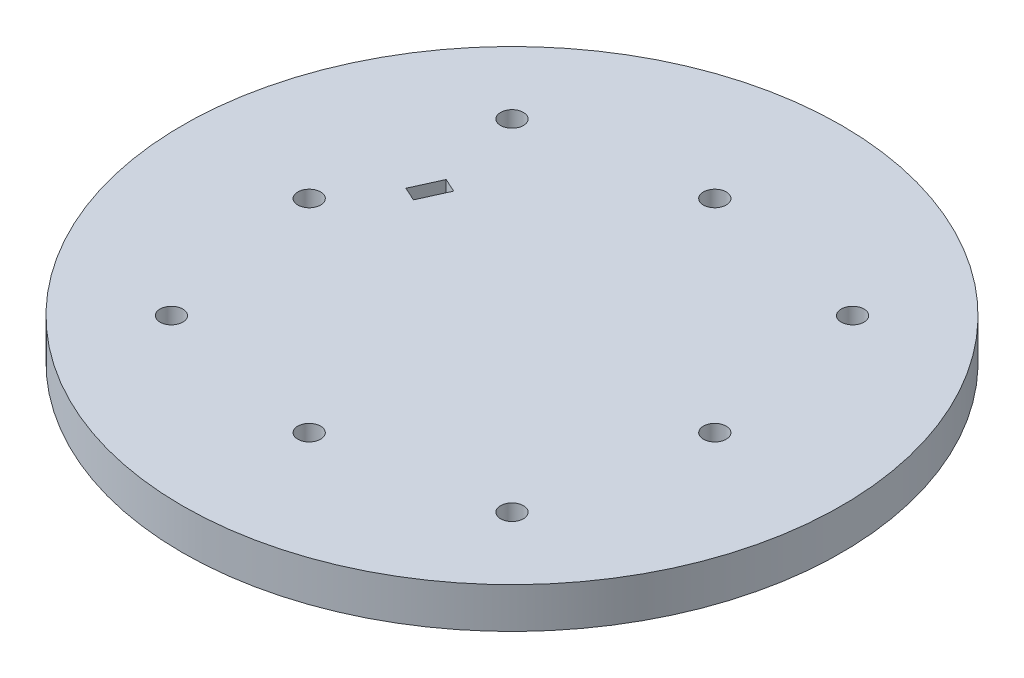
ISO-10303-21;
HEADER;
FILE_DESCRIPTION(('STEP AP214'),'2;1');
FILE_NAME('part.step','',(''),(''),'','','');
FILE_SCHEMA(('AUTOMOTIVE_DESIGN { 1 0 10303 214 1 1 1 1 }'));
ENDSEC;
DATA;
#1=APPLICATION_CONTEXT('core data for automotive mechanical design processes');
#2=APPLICATION_PROTOCOL_DEFINITION('international standard','automotive_design',2000,#1);
#3=PRODUCT_CONTEXT('',#1,'mechanical');
#4=PRODUCT('Part','Part','',(#3));
#5=PRODUCT_RELATED_PRODUCT_CATEGORY('part','',(#4));
#6=PRODUCT_DEFINITION_FORMATION('','',#4);
#7=PRODUCT_DEFINITION_CONTEXT('part definition',#1,'design');
#8=PRODUCT_DEFINITION('design','',#6,#7);
#9=PRODUCT_DEFINITION_SHAPE('','',#8);
#10=(LENGTH_UNIT() NAMED_UNIT(*) SI_UNIT(.MILLI.,.METRE.));
#11=(NAMED_UNIT(*) PLANE_ANGLE_UNIT() SI_UNIT($,.RADIAN.));
#12=(NAMED_UNIT(*) SI_UNIT($,.STERADIAN.) SOLID_ANGLE_UNIT());
#13=UNCERTAINTY_MEASURE_WITH_UNIT(LENGTH_MEASURE(1.E-05),#10,'distance_accuracy_value','');
#14=(GEOMETRIC_REPRESENTATION_CONTEXT(3) GLOBAL_UNCERTAINTY_ASSIGNED_CONTEXT((#13)) GLOBAL_UNIT_ASSIGNED_CONTEXT((#10,
#11,#12)) REPRESENTATION_CONTEXT('',''));
#15=CARTESIAN_POINT('',(0.,0.,0.));
#16=DIRECTION('',(0.,0.,1.));
#17=DIRECTION('',(1.,0.,0.));
#18=AXIS2_PLACEMENT_3D('',#15,#16,#17);
#19=CARTESIAN_POINT('',(0.,8.,0.));
#20=DIRECTION('',(0.,-1.,0.));
#21=DIRECTION('',(0.,0.,-1.));
#22=AXIS2_PLACEMENT_3D('',#19,#20,#21);
#23=CYLINDRICAL_SURFACE('',#22,65.);
#24=CARTESIAN_POINT('',(0.,8.,0.));
#25=DIRECTION('',(0.,1.,0.));
#26=DIRECTION('',(0.,0.,1.));
#27=AXIS2_PLACEMENT_3D('',#24,#25,#26);
#28=CIRCLE('',#27,65.);
#29=CARTESIAN_POINT('',(0.,8.,65.));
#30=VERTEX_POINT('',#29);
#31=EDGE_CURVE('E210',#30,#30,#28,.T.);
#32=ORIENTED_EDGE('',*,*,#31,.F.);
#33=EDGE_LOOP('',(#32));
#34=FACE_BOUND('',#33,.T.);
#35=CARTESIAN_POINT('',(0.,0.,0.));
#36=DIRECTION('',(0.,1.,0.));
#37=DIRECTION('',(0.,0.,1.));
#38=AXIS2_PLACEMENT_3D('',#35,#36,#37);
#39=CIRCLE('',#38,65.);
#40=CARTESIAN_POINT('',(0.,0.,65.));
#41=VERTEX_POINT('',#40);
#42=EDGE_CURVE('E207',#41,#41,#39,.T.);
#43=ORIENTED_EDGE('',*,*,#42,.T.);
#44=EDGE_LOOP('',(#43));
#45=FACE_BOUND('',#44,.T.);
#46=ADVANCED_FACE('F41',(#34,#45),#23,.T.);
#47=CARTESIAN_POINT('',(0.,8.,0.));
#48=DIRECTION('',(0.,1.,0.));
#49=DIRECTION('',(0.,0.,1.));
#50=AXIS2_PLACEMENT_3D('',#47,#48,#49);
#51=PLANE('',#50);
#52=DIRECTION('',(-0.412202483156709,0.,0.911092263648113));
#53=VECTOR('',#52,1.);
#54=CARTESIAN_POINT('',(-29.4804676225616,8.,-10.0450001869136));
#55=LINE('',#54,#53);
#56=CARTESIAN_POINT('',(-27.0072527236214,8.,-15.5115537688023));
#57=VERTEX_POINT('',#56);
#58=CARTESIAN_POINT('',(-29.4804676225616,8.,-10.0450001869136));
#59=VERTEX_POINT('',#58);
#60=EDGE_CURVE('E99',#57,#59,#55,.T.);
#61=ORIENTED_EDGE('',*,*,#60,.T.);
#62=DIRECTION('',(-0.911092263648113,0.,-0.412202483156709));
#63=VECTOR('',#62,1.);
#64=CARTESIAN_POINT('',(-29.4804676225616,8.,-10.0450001869136));
#65=LINE('',#64,#63);
#66=CARTESIAN_POINT('',(-32.213744413506,8.,-11.2816076363837));
#67=VERTEX_POINT('',#66);
#68=EDGE_CURVE('E109',#59,#67,#65,.T.);
#69=ORIENTED_EDGE('',*,*,#68,.T.);
#70=DIRECTION('',(0.412202483156708,0.,-0.911092263648114));
#71=VECTOR('',#70,1.);
#72=CARTESIAN_POINT('',(-32.213744413506,8.,-11.2816076363837));
#73=LINE('',#72,#71);
#74=CARTESIAN_POINT('',(-29.7405295145657,8.,-16.7481612182724));
#75=VERTEX_POINT('',#74);
#76=EDGE_CURVE('E55',#67,#75,#73,.T.);
#77=ORIENTED_EDGE('',*,*,#76,.T.);
#78=DIRECTION('',(0.911092263648114,0.,0.412202483156707));
#79=VECTOR('',#78,1.);
#80=CARTESIAN_POINT('',(-29.7405295145657,8.,-16.7481612182724));
#81=LINE('',#80,#79);
#82=EDGE_CURVE('E106',#75,#57,#81,.T.);
#83=ORIENTED_EDGE('',*,*,#82,.T.);
#84=EDGE_LOOP('',(#61,#69,#77,#83));
#85=FACE_BOUND('',#84,.T.);
#86=CARTESIAN_POINT('',(-33.5875721063614,8.,33.5875721063606));
#87=DIRECTION('',(0.,1.,0.));
#88=DIRECTION('',(0.,0.,1.));
#89=AXIS2_PLACEMENT_3D('',#86,#87,#88);
#90=CIRCLE('',#89,2.25);
#91=CARTESIAN_POINT('',(-33.5875721063614,8.,35.8375721063606));
#92=VERTEX_POINT('',#91);
#93=EDGE_CURVE('E169',#92,#92,#90,.T.);
#94=ORIENTED_EDGE('',*,*,#93,.F.);
#95=EDGE_LOOP('',(#94));
#96=FACE_BOUND('',#95,.T.);
#97=CARTESIAN_POINT('',(33.5875721063607,8.,33.5875721063613));
#98=DIRECTION('',(0.,1.,0.));
#99=DIRECTION('',(0.,0.,1.));
#100=AXIS2_PLACEMENT_3D('',#97,#98,#99);
#101=CIRCLE('',#100,2.25);
#102=CARTESIAN_POINT('',(33.5875721063607,8.,35.8375721063613));
#103=VERTEX_POINT('',#102);
#104=EDGE_CURVE('E163',#103,#103,#101,.T.);
#105=ORIENTED_EDGE('',*,*,#104,.F.);
#106=EDGE_LOOP('',(#105));
#107=FACE_BOUND('',#106,.T.);
#108=CARTESIAN_POINT('',(33.5875721063612,8.,-33.5875721063608));
#109=DIRECTION('',(0.,1.,0.));
#110=DIRECTION('',(0.,0.,1.));
#111=AXIS2_PLACEMENT_3D('',#108,#109,#110);
#112=CIRCLE('',#111,2.25);
#113=CARTESIAN_POINT('',(33.5875721063612,8.,-31.3375721063608));
#114=VERTEX_POINT('',#113);
#115=EDGE_CURVE('E156',#114,#114,#112,.T.);
#116=ORIENTED_EDGE('',*,*,#115,.F.);
#117=EDGE_LOOP('',(#116));
#118=FACE_BOUND('',#117,.T.);
#119=CARTESIAN_POINT('',(-33.5875721063609,8.,-33.5875721063611));
#120=DIRECTION('',(0.,1.,0.));
#121=DIRECTION('',(0.,0.,1.));
#122=AXIS2_PLACEMENT_3D('',#119,#120,#121);
#123=CIRCLE('',#122,2.25);
#124=CARTESIAN_POINT('',(-33.5875721063609,8.,-31.3375721063611));
#125=VERTEX_POINT('',#124);
#126=EDGE_CURVE('E159',#125,#125,#123,.T.);
#127=ORIENTED_EDGE('',*,*,#126,.F.);
#128=EDGE_LOOP('',(#127));
#129=FACE_BOUND('',#128,.T.);
#130=CARTESIAN_POINT('',(-40.,8.,0.));
#131=DIRECTION('',(0.,1.,0.));
#132=DIRECTION('',(0.,0.,1.));
#133=AXIS2_PLACEMENT_3D('',#130,#131,#132);
#134=CIRCLE('',#133,2.25);
#135=CARTESIAN_POINT('',(-40.,8.,2.25));
#136=VERTEX_POINT('',#135);
#137=EDGE_CURVE('E184',#136,#136,#134,.T.);
#138=ORIENTED_EDGE('',*,*,#137,.F.);
#139=EDGE_LOOP('',(#138));
#140=FACE_BOUND('',#139,.T.);
#141=CARTESIAN_POINT('',(1.39659253553725E-13,8.,-40.));
#142=DIRECTION('',(0.,1.,0.));
#143=DIRECTION('',(0.,0.,1.));
#144=AXIS2_PLACEMENT_3D('',#141,#142,#143);
#145=CIRCLE('',#144,2.25);
#146=CARTESIAN_POINT('',(1.39659253553725E-13,8.,-37.75));
#147=VERTEX_POINT('',#146);
#148=EDGE_CURVE('E187',#147,#147,#145,.T.);
#149=ORIENTED_EDGE('',*,*,#148,.F.);
#150=EDGE_LOOP('',(#149));
#151=FACE_BOUND('',#150,.T.);
#152=CARTESIAN_POINT('',(40.,8.,2.79318507107451E-13));
#153=DIRECTION('',(0.,1.,0.));
#154=DIRECTION('',(0.,0.,1.));
#155=AXIS2_PLACEMENT_3D('',#152,#153,#154);
#156=CIRCLE('',#155,2.25);
#157=CARTESIAN_POINT('',(40.,8.,2.25000000000028));
#158=VERTEX_POINT('',#157);
#159=EDGE_CURVE('E193',#158,#158,#156,.T.);
#160=ORIENTED_EDGE('',*,*,#159,.F.);
#161=EDGE_LOOP('',(#160));
#162=FACE_BOUND('',#161,.T.);
#163=CARTESIAN_POINT('',(-4.18977760661176E-13,8.,40.));
#164=DIRECTION('',(0.,1.,0.));
#165=DIRECTION('',(0.,0.,1.));
#166=AXIS2_PLACEMENT_3D('',#163,#164,#165);
#167=CIRCLE('',#166,2.25);
#168=CARTESIAN_POINT('',(-4.18977760661176E-13,8.,42.25));
#169=VERTEX_POINT('',#168);
#170=EDGE_CURVE('E199',#169,#169,#167,.T.);
#171=ORIENTED_EDGE('',*,*,#170,.F.);
#172=EDGE_LOOP('',(#171));
#173=FACE_BOUND('',#172,.T.);
#174=ORIENTED_EDGE('',*,*,#31,.T.);
#175=EDGE_LOOP('',(#174));
#176=FACE_BOUND('',#175,.T.);
#177=ADVANCED_FACE('F113',(#85,#96,#107,#118,#129,#140,#151,#162,#173,#176),#51,.T.);
#178=CARTESIAN_POINT('',(0.,0.,0.));
#179=DIRECTION('',(0.,1.,0.));
#180=DIRECTION('',(0.,0.,1.));
#181=AXIS2_PLACEMENT_3D('',#178,#179,#180);
#182=PLANE('',#181);
#183=CARTESIAN_POINT('',(-27.,0.,0.));
#184=DIRECTION('',(0.,-1.,0.));
#185=DIRECTION('',(0.,0.,-1.));
#186=AXIS2_PLACEMENT_3D('',#183,#184,#185);
#187=CIRCLE('',#186,1.7);
#188=CARTESIAN_POINT('',(-27.,0.,-1.7));
#189=VERTEX_POINT('',#188);
#190=EDGE_CURVE('E134',#189,#189,#187,.T.);
#191=ORIENTED_EDGE('',*,*,#190,.F.);
#192=EDGE_LOOP('',(#191));
#193=FACE_BOUND('',#192,.T.);
#194=CARTESIAN_POINT('',(13.5000000000001,0.,23.3826859021798));
#195=DIRECTION('',(0.,-1.,0.));
#196=DIRECTION('',(0.,0.,-1.));
#197=AXIS2_PLACEMENT_3D('',#194,#195,#196);
#198=CIRCLE('',#197,1.7);
#199=CARTESIAN_POINT('',(13.5000000000001,0.,21.6826859021798));
#200=VERTEX_POINT('',#199);
#201=EDGE_CURVE('E137',#200,#200,#198,.T.);
#202=ORIENTED_EDGE('',*,*,#201,.F.);
#203=EDGE_LOOP('',(#202));
#204=FACE_BOUND('',#203,.T.);
#205=CARTESIAN_POINT('',(13.4999999999998,0.,-23.38268590218));
#206=DIRECTION('',(0.,-1.,0.));
#207=DIRECTION('',(0.,0.,-1.));
#208=AXIS2_PLACEMENT_3D('',#205,#206,#207);
#209=CIRCLE('',#208,1.7);
#210=CARTESIAN_POINT('',(13.4999999999998,0.,-25.08268590218));
#211=VERTEX_POINT('',#210);
#212=EDGE_CURVE('E143',#211,#211,#209,.T.);
#213=ORIENTED_EDGE('',*,*,#212,.F.);
#214=EDGE_LOOP('',(#213));
#215=FACE_BOUND('',#214,.T.);
#216=CARTESIAN_POINT('',(-33.5875721063614,0.,33.5875721063606));
#217=DIRECTION('',(0.,1.,0.));
#218=DIRECTION('',(0.,0.,1.));
#219=AXIS2_PLACEMENT_3D('',#216,#217,#218);
#220=CIRCLE('',#219,2.25);
#221=CARTESIAN_POINT('',(-33.5875721063614,0.,35.8375721063606));
#222=VERTEX_POINT('',#221);
#223=EDGE_CURVE('E153',#222,#222,#220,.T.);
#224=ORIENTED_EDGE('',*,*,#223,.T.);
#225=EDGE_LOOP('',(#224));
#226=FACE_BOUND('',#225,.T.);
#227=CARTESIAN_POINT('',(33.5875721063607,0.,33.5875721063613));
#228=DIRECTION('',(0.,1.,0.));
#229=DIRECTION('',(0.,0.,1.));
#230=AXIS2_PLACEMENT_3D('',#227,#228,#229);
#231=CIRCLE('',#230,2.25);
#232=CARTESIAN_POINT('',(33.5875721063607,0.,35.8375721063613));
#233=VERTEX_POINT('',#232);
#234=EDGE_CURVE('E166',#233,#233,#231,.T.);
#235=ORIENTED_EDGE('',*,*,#234,.T.);
#236=EDGE_LOOP('',(#235));
#237=FACE_BOUND('',#236,.T.);
#238=CARTESIAN_POINT('',(33.5875721063612,0.,-33.5875721063608));
#239=DIRECTION('',(0.,1.,0.));
#240=DIRECTION('',(0.,0.,1.));
#241=AXIS2_PLACEMENT_3D('',#238,#239,#240);
#242=CIRCLE('',#241,2.25);
#243=CARTESIAN_POINT('',(33.5875721063612,0.,-31.3375721063608));
#244=VERTEX_POINT('',#243);
#245=EDGE_CURVE('E160',#244,#244,#242,.T.);
#246=ORIENTED_EDGE('',*,*,#245,.T.);
#247=EDGE_LOOP('',(#246));
#248=FACE_BOUND('',#247,.T.);
#249=CARTESIAN_POINT('',(-33.5875721063609,0.,-33.5875721063611));
#250=DIRECTION('',(0.,1.,0.));
#251=DIRECTION('',(0.,0.,1.));
#252=AXIS2_PLACEMENT_3D('',#249,#250,#251);
#253=CIRCLE('',#252,2.25);
#254=CARTESIAN_POINT('',(-33.5875721063609,0.,-31.3375721063611));
#255=VERTEX_POINT('',#254);
#256=EDGE_CURVE('E174',#255,#255,#253,.T.);
#257=ORIENTED_EDGE('',*,*,#256,.T.);
#258=EDGE_LOOP('',(#257));
#259=FACE_BOUND('',#258,.T.);
#260=CARTESIAN_POINT('',(-40.,0.,0.));
#261=DIRECTION('',(0.,1.,0.));
#262=DIRECTION('',(0.,0.,1.));
#263=AXIS2_PLACEMENT_3D('',#260,#261,#262);
#264=CIRCLE('',#263,2.25);
#265=CARTESIAN_POINT('',(-40.,0.,2.25));
#266=VERTEX_POINT('',#265);
#267=EDGE_CURVE('E180',#266,#266,#264,.T.);
#268=ORIENTED_EDGE('',*,*,#267,.T.);
#269=EDGE_LOOP('',(#268));
#270=FACE_BOUND('',#269,.T.);
#271=CARTESIAN_POINT('',(1.39659253553725E-13,0.,-40.));
#272=DIRECTION('',(0.,1.,0.));
#273=DIRECTION('',(0.,0.,1.));
#274=AXIS2_PLACEMENT_3D('',#271,#272,#273);
#275=CIRCLE('',#274,2.25);
#276=CARTESIAN_POINT('',(1.39659253553725E-13,0.,-37.75));
#277=VERTEX_POINT('',#276);
#278=EDGE_CURVE('E190',#277,#277,#275,.T.);
#279=ORIENTED_EDGE('',*,*,#278,.T.);
#280=EDGE_LOOP('',(#279));
#281=FACE_BOUND('',#280,.T.);
#282=CARTESIAN_POINT('',(40.,0.,2.79318507107451E-13));
#283=DIRECTION('',(0.,1.,0.));
#284=DIRECTION('',(0.,0.,1.));
#285=AXIS2_PLACEMENT_3D('',#282,#283,#284);
#286=CIRCLE('',#285,2.25);
#287=CARTESIAN_POINT('',(40.,0.,2.25000000000028));
#288=VERTEX_POINT('',#287);
#289=EDGE_CURVE('E196',#288,#288,#286,.T.);
#290=ORIENTED_EDGE('',*,*,#289,.T.);
#291=EDGE_LOOP('',(#290));
#292=FACE_BOUND('',#291,.T.);
#293=CARTESIAN_POINT('',(-4.18977760661176E-13,0.,40.));
#294=DIRECTION('',(0.,1.,0.));
#295=DIRECTION('',(0.,0.,1.));
#296=AXIS2_PLACEMENT_3D('',#293,#294,#295);
#297=CIRCLE('',#296,2.25);
#298=CARTESIAN_POINT('',(-4.18977760661176E-13,0.,42.25));
#299=VERTEX_POINT('',#298);
#300=EDGE_CURVE('E177',#299,#299,#297,.T.);
#301=ORIENTED_EDGE('',*,*,#300,.T.);
#302=EDGE_LOOP('',(#301));
#303=FACE_BOUND('',#302,.T.);
#304=DIRECTION('',(0.911092263648114,0.,0.412202483156708));
#305=VECTOR('',#304,1.);
#306=CARTESIAN_POINT('',(-27.0072527236214,0.,-15.5115537688023));
#307=LINE('',#306,#305);
#308=CARTESIAN_POINT('',(-29.7405295145657,0.,-16.7481612182724));
#309=VERTEX_POINT('',#308);
#310=CARTESIAN_POINT('',(-17.7000896427875,0.,-11.300744516946));
#311=VERTEX_POINT('',#310);
#312=EDGE_CURVE('E150',#309,#311,#307,.T.);
#313=ORIENTED_EDGE('',*,*,#312,.F.);
#314=DIRECTION('',(0.412202483156708,0.,-0.911092263648114));
#315=VECTOR('',#314,1.);
#316=CARTESIAN_POINT('',(-32.213744413506,0.,-11.2816076363837));
#317=LINE('',#316,#315);
#318=CARTESIAN_POINT('',(-32.213744413506,0.,-11.2816076363837));
#319=VERTEX_POINT('',#318);
#320=EDGE_CURVE('E116',#319,#309,#317,.T.);
#321=ORIENTED_EDGE('',*,*,#320,.F.);
#322=DIRECTION('',(-0.911092263648113,0.,-0.412202483156709));
#323=VECTOR('',#322,1.);
#324=CARTESIAN_POINT('',(-18.5473604587843,0.,-5.09857038903311));
#325=LINE('',#324,#323);
#326=CARTESIAN_POINT('',(-20.1733045417278,0.,-5.83419093505734));
#327=VERTEX_POINT('',#326);
#328=EDGE_CURVE('E133',#327,#319,#325,.T.);
#329=ORIENTED_EDGE('',*,*,#328,.F.);
#330=CARTESIAN_POINT('',(0.,0.,0.));
#331=DIRECTION('',(0.,-1.,0.));
#332=DIRECTION('',(0.,0.,-1.));
#333=AXIS2_PLACEMENT_3D('',#330,#331,#332);
#334=CIRCLE('',#333,21.);
#335=EDGE_CURVE('E183',#311,#327,#334,.T.);
#336=ORIENTED_EDGE('',*,*,#335,.F.);
#337=EDGE_LOOP('',(#313,#321,#329,#336));
#338=FACE_BOUND('',#337,.T.);
#339=ORIENTED_EDGE('',*,*,#42,.F.);
#340=EDGE_LOOP('',(#339));
#341=FACE_BOUND('',#340,.T.);
#342=ADVANCED_FACE('F224',(#193,#204,#215,#226,#237,#248,#259,#270,#281,#292,#303,#338,#341),
#182,.F.);
#343=CARTESIAN_POINT('',(0.,4.5,0.));
#344=DIRECTION('',(0.,-1.,0.));
#345=DIRECTION('',(0.,0.,-1.));
#346=AXIS2_PLACEMENT_3D('',#343,#344,#345);
#347=CYLINDRICAL_SURFACE('',#346,21.);
#348=CARTESIAN_POINT('',(0.,4.5,0.));
#349=DIRECTION('',(0.,-1.,0.));
#350=DIRECTION('',(0.,0.,-1.));
#351=AXIS2_PLACEMENT_3D('',#348,#349,#350);
#352=CIRCLE('',#351,21.);
#353=CARTESIAN_POINT('',(0.,4.5,-21.));
#354=VERTEX_POINT('',#353);
#355=EDGE_CURVE('E204',#354,#354,#352,.T.);
#356=ORIENTED_EDGE('',*,*,#355,.F.);
#357=EDGE_LOOP('',(#356));
#358=FACE_BOUND('',#357,.T.);
#359=CARTESIAN_POINT('',(0.,2.,0.));
#360=DIRECTION('',(0.,-1.,0.));
#361=DIRECTION('',(0.,0.,-1.));
#362=AXIS2_PLACEMENT_3D('',#359,#360,#361);
#363=CIRCLE('',#362,21.);
#364=CARTESIAN_POINT('',(-17.7000896427875,2.,-11.300744516946));
#365=VERTEX_POINT('',#364);
#366=CARTESIAN_POINT('',(-20.1733045417278,2.,-5.83419093505734));
#367=VERTEX_POINT('',#366);
#368=EDGE_CURVE('E213',#365,#367,#363,.F.);
#369=ORIENTED_EDGE('',*,*,#368,.F.);
#370=DIRECTION('',(0.,-1.,0.));
#371=VECTOR('',#370,1.);
#372=CARTESIAN_POINT('',(-17.7000896427875,4.5,-11.300744516946));
#373=LINE('',#372,#371);
#374=EDGE_CURVE('E11',#365,#311,#373,.T.);
#375=ORIENTED_EDGE('',*,*,#374,.T.);
#376=ORIENTED_EDGE('',*,*,#335,.T.);
#377=DIRECTION('',(0.,-1.,0.));
#378=VECTOR('',#377,1.);
#379=CARTESIAN_POINT('',(-20.1733045417278,4.5,-5.83419093505734));
#380=LINE('',#379,#378);
#381=EDGE_CURVE('E48',#327,#367,#380,.F.);
#382=ORIENTED_EDGE('',*,*,#381,.T.);
#383=EDGE_LOOP('',(#369,#375,#376,#382));
#384=FACE_BOUND('',#383,.T.);
#385=ADVANCED_FACE('F219',(#358,#384),#347,.F.);
#386=CARTESIAN_POINT('',(0.,4.5,0.));
#387=DIRECTION('',(0.,-1.,0.));
#388=DIRECTION('',(0.,0.,-1.));
#389=AXIS2_PLACEMENT_3D('',#386,#387,#388);
#390=PLANE('',#389);
#391=ORIENTED_EDGE('',*,*,#355,.T.);
#392=EDGE_LOOP('',(#391));
#393=FACE_BOUND('',#392,.T.);
#394=ADVANCED_FACE('F260',(#393),#390,.T.);
#395=CARTESIAN_POINT('',(-4.18977760661176E-13,0.,40.));
#396=DIRECTION('',(0.,1.,0.));
#397=DIRECTION('',(0.,0.,1.));
#398=AXIS2_PLACEMENT_3D('',#395,#396,#397);
#399=CYLINDRICAL_SURFACE('',#398,2.25);
#400=ORIENTED_EDGE('',*,*,#300,.F.);
#401=EDGE_LOOP('',(#400));
#402=FACE_BOUND('',#401,.T.);
#403=ORIENTED_EDGE('',*,*,#170,.T.);
#404=EDGE_LOOP('',(#403));
#405=FACE_BOUND('',#404,.T.);
#406=ADVANCED_FACE('F267',(#402,#405),#399,.F.);
#407=CARTESIAN_POINT('',(40.,0.,2.79318507107451E-13));
#408=DIRECTION('',(0.,1.,0.));
#409=DIRECTION('',(0.,0.,1.));
#410=AXIS2_PLACEMENT_3D('',#407,#408,#409);
#411=CYLINDRICAL_SURFACE('',#410,2.25);
#412=ORIENTED_EDGE('',*,*,#289,.F.);
#413=EDGE_LOOP('',(#412));
#414=FACE_BOUND('',#413,.T.);
#415=ORIENTED_EDGE('',*,*,#159,.T.);
#416=EDGE_LOOP('',(#415));
#417=FACE_BOUND('',#416,.T.);
#418=ADVANCED_FACE('F271',(#414,#417),#411,.F.);
#419=CARTESIAN_POINT('',(1.39659253553725E-13,0.,-40.));
#420=DIRECTION('',(0.,1.,0.));
#421=DIRECTION('',(0.,0.,1.));
#422=AXIS2_PLACEMENT_3D('',#419,#420,#421);
#423=CYLINDRICAL_SURFACE('',#422,2.25);
#424=ORIENTED_EDGE('',*,*,#278,.F.);
#425=EDGE_LOOP('',(#424));
#426=FACE_BOUND('',#425,.T.);
#427=ORIENTED_EDGE('',*,*,#148,.T.);
#428=EDGE_LOOP('',(#427));
#429=FACE_BOUND('',#428,.T.);
#430=ADVANCED_FACE('F275',(#426,#429),#423,.F.);
#431=CARTESIAN_POINT('',(-40.,0.,0.));
#432=DIRECTION('',(0.,1.,0.));
#433=DIRECTION('',(0.,0.,1.));
#434=AXIS2_PLACEMENT_3D('',#431,#432,#433);
#435=CYLINDRICAL_SURFACE('',#434,2.25);
#436=ORIENTED_EDGE('',*,*,#267,.F.);
#437=EDGE_LOOP('',(#436));
#438=FACE_BOUND('',#437,.T.);
#439=ORIENTED_EDGE('',*,*,#137,.T.);
#440=EDGE_LOOP('',(#439));
#441=FACE_BOUND('',#440,.T.);
#442=ADVANCED_FACE('F279',(#438,#441),#435,.F.);
#443=CARTESIAN_POINT('',(-33.5875721063609,0.,-33.5875721063611));
#444=DIRECTION('',(0.,1.,0.));
#445=DIRECTION('',(0.,0.,1.));
#446=AXIS2_PLACEMENT_3D('',#443,#444,#445);
#447=CYLINDRICAL_SURFACE('',#446,2.25);
#448=ORIENTED_EDGE('',*,*,#256,.F.);
#449=EDGE_LOOP('',(#448));
#450=FACE_BOUND('',#449,.T.);
#451=ORIENTED_EDGE('',*,*,#126,.T.);
#452=EDGE_LOOP('',(#451));
#453=FACE_BOUND('',#452,.T.);
#454=ADVANCED_FACE('F283',(#450,#453),#447,.F.);
#455=CARTESIAN_POINT('',(33.5875721063612,0.,-33.5875721063608));
#456=DIRECTION('',(0.,1.,0.));
#457=DIRECTION('',(0.,0.,1.));
#458=AXIS2_PLACEMENT_3D('',#455,#456,#457);
#459=CYLINDRICAL_SURFACE('',#458,2.25);
#460=ORIENTED_EDGE('',*,*,#245,.F.);
#461=EDGE_LOOP('',(#460));
#462=FACE_BOUND('',#461,.T.);
#463=ORIENTED_EDGE('',*,*,#115,.T.);
#464=EDGE_LOOP('',(#463));
#465=FACE_BOUND('',#464,.T.);
#466=ADVANCED_FACE('F287',(#462,#465),#459,.F.);
#467=CARTESIAN_POINT('',(33.5875721063607,0.,33.5875721063613));
#468=DIRECTION('',(0.,1.,0.));
#469=DIRECTION('',(0.,0.,1.));
#470=AXIS2_PLACEMENT_3D('',#467,#468,#469);
#471=CYLINDRICAL_SURFACE('',#470,2.25);
#472=ORIENTED_EDGE('',*,*,#234,.F.);
#473=EDGE_LOOP('',(#472));
#474=FACE_BOUND('',#473,.T.);
#475=ORIENTED_EDGE('',*,*,#104,.T.);
#476=EDGE_LOOP('',(#475));
#477=FACE_BOUND('',#476,.T.);
#478=ADVANCED_FACE('F292',(#474,#477),#471,.F.);
#479=CARTESIAN_POINT('',(-33.5875721063614,0.,33.5875721063606));
#480=DIRECTION('',(0.,1.,0.));
#481=DIRECTION('',(0.,0.,1.));
#482=AXIS2_PLACEMENT_3D('',#479,#480,#481);
#483=CYLINDRICAL_SURFACE('',#482,2.25);
#484=ORIENTED_EDGE('',*,*,#223,.F.);
#485=EDGE_LOOP('',(#484));
#486=FACE_BOUND('',#485,.T.);
#487=ORIENTED_EDGE('',*,*,#93,.T.);
#488=EDGE_LOOP('',(#487));
#489=FACE_BOUND('',#488,.T.);
#490=ADVANCED_FACE('F289',(#486,#489),#483,.F.);
#491=CARTESIAN_POINT('',(-27.0072527236214,2.,-15.5115537688023));
#492=DIRECTION('',(0.412202483156708,0.,-0.911092263648114));
#493=DIRECTION('',(-0.911092263648114,0.,-0.412202483156708));
#494=AXIS2_PLACEMENT_3D('',#491,#492,#493);
#495=PLANE('',#494);
#496=DIRECTION('',(0.911092263648114,0.,0.412202483156708));
#497=VECTOR('',#496,1.);
#498=CARTESIAN_POINT('',(-27.0072527236214,2.,-15.5115537688023));
#499=LINE('',#498,#497);
#500=CARTESIAN_POINT('',(-27.0072527236214,2.,-15.5115537688023));
#501=VERTEX_POINT('',#500);
#502=EDGE_CURVE('E63',#501,#365,#499,.T.);
#503=ORIENTED_EDGE('',*,*,#502,.F.);
#504=DIRECTION('',(0.,-1.,0.));
#505=VECTOR('',#504,1.);
#506=CARTESIAN_POINT('',(-27.0072527236214,8.,-15.5115537688023));
#507=LINE('',#506,#505);
#508=EDGE_CURVE('E123',#57,#501,#507,.T.);
#509=ORIENTED_EDGE('',*,*,#508,.F.);
#510=ORIENTED_EDGE('',*,*,#82,.F.);
#511=DIRECTION('',(0.,-1.,0.));
#512=VECTOR('',#511,1.);
#513=CARTESIAN_POINT('',(-29.7405295145657,8.,-16.7481612182724));
#514=LINE('',#513,#512);
#515=EDGE_CURVE('E126',#75,#309,#514,.T.);
#516=ORIENTED_EDGE('',*,*,#515,.T.);
#517=ORIENTED_EDGE('',*,*,#312,.T.);
#518=ORIENTED_EDGE('',*,*,#374,.F.);
#519=EDGE_LOOP('',(#503,#509,#510,#516,#517,#518));
#520=FACE_BOUND('',#519,.T.);
#521=ADVANCED_FACE('F228',(#520),#495,.F.);
#522=CARTESIAN_POINT('',(-18.5473604587843,2.,-5.09857038903311));
#523=DIRECTION('',(-0.412202483156709,0.,0.911092263648113));
#524=DIRECTION('',(0.911092263648113,0.,0.412202483156709));
#525=AXIS2_PLACEMENT_3D('',#522,#523,#524);
#526=PLANE('',#525);
#527=ORIENTED_EDGE('',*,*,#328,.T.);
#528=DIRECTION('',(0.,-1.,0.));
#529=VECTOR('',#528,1.);
#530=CARTESIAN_POINT('',(-32.213744413506,8.,-11.2816076363837));
#531=LINE('',#530,#529);
#532=EDGE_CURVE('E105',#67,#319,#531,.T.);
#533=ORIENTED_EDGE('',*,*,#532,.F.);
#534=ORIENTED_EDGE('',*,*,#68,.F.);
#535=DIRECTION('',(0.,-1.,0.));
#536=VECTOR('',#535,1.);
#537=CARTESIAN_POINT('',(-29.4804676225616,8.,-10.0450001869136));
#538=LINE('',#537,#536);
#539=CARTESIAN_POINT('',(-29.4804676225616,2.,-10.0450001869136));
#540=VERTEX_POINT('',#539);
#541=EDGE_CURVE('E95',#59,#540,#538,.T.);
#542=ORIENTED_EDGE('',*,*,#541,.T.);
#543=DIRECTION('',(-0.911092263648113,0.,-0.412202483156709));
#544=VECTOR('',#543,1.);
#545=CARTESIAN_POINT('',(-18.5473604587843,2.,-5.09857038903311));
#546=LINE('',#545,#544);
#547=EDGE_CURVE('E148',#367,#540,#546,.T.);
#548=ORIENTED_EDGE('',*,*,#547,.F.);
#549=ORIENTED_EDGE('',*,*,#381,.F.);
#550=EDGE_LOOP('',(#527,#533,#534,#542,#548,#549));
#551=FACE_BOUND('',#550,.T.);
#552=ADVANCED_FACE('F110',(#551),#526,.F.);
#553=CARTESIAN_POINT('',(0.,2.,0.));
#554=DIRECTION('',(0.,-1.,0.));
#555=DIRECTION('',(0.,0.,-1.));
#556=AXIS2_PLACEMENT_3D('',#553,#554,#555);
#557=PLANE('',#556);
#558=ORIENTED_EDGE('',*,*,#368,.T.);
#559=ORIENTED_EDGE('',*,*,#547,.T.);
#560=DIRECTION('',(0.412202483156709,0.,-0.911092263648113));
#561=VECTOR('',#560,1.);
#562=CARTESIAN_POINT('',(-29.4804676225616,2.,-10.0450001869136));
#563=LINE('',#562,#561);
#564=EDGE_CURVE('E101',#540,#501,#563,.T.);
#565=ORIENTED_EDGE('',*,*,#564,.T.);
#566=ORIENTED_EDGE('',*,*,#502,.T.);
#567=EDGE_LOOP('',(#558,#559,#565,#566));
#568=FACE_BOUND('',#567,.T.);
#569=ADVANCED_FACE('F229',(#568),#557,.T.);
#570=CARTESIAN_POINT('',(13.4999999999998,6.,-23.38268590218));
#571=DIRECTION('',(0.,-1.,0.));
#572=DIRECTION('',(0.,0.,-1.));
#573=AXIS2_PLACEMENT_3D('',#570,#571,#572);
#574=CYLINDRICAL_SURFACE('',#573,1.7);
#575=CARTESIAN_POINT('',(13.4999999999998,6.,-23.38268590218));
#576=DIRECTION('',(0.,-1.,0.));
#577=DIRECTION('',(0.,0.,-1.));
#578=AXIS2_PLACEMENT_3D('',#575,#576,#577);
#579=CIRCLE('',#578,1.7);
#580=CARTESIAN_POINT('',(13.4999999999998,6.,-25.08268590218));
#581=VERTEX_POINT('',#580);
#582=EDGE_CURVE('E125',#581,#581,#579,.T.);
#583=ORIENTED_EDGE('',*,*,#582,.F.);
#584=EDGE_LOOP('',(#583));
#585=FACE_BOUND('',#584,.T.);
#586=ORIENTED_EDGE('',*,*,#212,.T.);
#587=EDGE_LOOP('',(#586));
#588=FACE_BOUND('',#587,.T.);
#589=ADVANCED_FACE('F231',(#585,#588),#574,.F.);
#590=CARTESIAN_POINT('',(13.4999999999998,6.,-23.38268590218));
#591=DIRECTION('',(0.,-1.,0.));
#592=DIRECTION('',(0.,0.,-1.));
#593=AXIS2_PLACEMENT_3D('',#590,#591,#592);
#594=PLANE('',#593);
#595=ORIENTED_EDGE('',*,*,#582,.T.);
#596=EDGE_LOOP('',(#595));
#597=FACE_BOUND('',#596,.T.);
#598=ADVANCED_FACE('F238',(#597),#594,.T.);
#599=CARTESIAN_POINT('',(13.5000000000001,6.,23.3826859021798));
#600=DIRECTION('',(0.,-1.,0.));
#601=DIRECTION('',(0.,0.,-1.));
#602=AXIS2_PLACEMENT_3D('',#599,#600,#601);
#603=CYLINDRICAL_SURFACE('',#602,1.7);
#604=CARTESIAN_POINT('',(13.5000000000001,6.,23.3826859021798));
#605=DIRECTION('',(0.,-1.,0.));
#606=DIRECTION('',(0.,0.,-1.));
#607=AXIS2_PLACEMENT_3D('',#604,#605,#606);
#608=CIRCLE('',#607,1.7);
#609=CARTESIAN_POINT('',(13.5000000000001,6.,21.6826859021798));
#610=VERTEX_POINT('',#609);
#611=EDGE_CURVE('E140',#610,#610,#608,.T.);
#612=ORIENTED_EDGE('',*,*,#611,.F.);
#613=EDGE_LOOP('',(#612));
#614=FACE_BOUND('',#613,.T.);
#615=ORIENTED_EDGE('',*,*,#201,.T.);
#616=EDGE_LOOP('',(#615));
#617=FACE_BOUND('',#616,.T.);
#618=ADVANCED_FACE('F339',(#614,#617),#603,.F.);
#619=CARTESIAN_POINT('',(13.5000000000001,6.,23.3826859021798));
#620=DIRECTION('',(0.,-1.,0.));
#621=DIRECTION('',(0.,0.,-1.));
#622=AXIS2_PLACEMENT_3D('',#619,#620,#621);
#623=PLANE('',#622);
#624=ORIENTED_EDGE('',*,*,#611,.T.);
#625=EDGE_LOOP('',(#624));
#626=FACE_BOUND('',#625,.T.);
#627=ADVANCED_FACE('F337',(#626),#623,.T.);
#628=CARTESIAN_POINT('',(-27.,6.,0.));
#629=DIRECTION('',(0.,-1.,0.));
#630=DIRECTION('',(0.,0.,-1.));
#631=AXIS2_PLACEMENT_3D('',#628,#629,#630);
#632=CYLINDRICAL_SURFACE('',#631,1.7);
#633=CARTESIAN_POINT('',(-27.,6.,0.));
#634=DIRECTION('',(0.,-1.,0.));
#635=DIRECTION('',(0.,0.,-1.));
#636=AXIS2_PLACEMENT_3D('',#633,#634,#635);
#637=CIRCLE('',#636,1.7);
#638=CARTESIAN_POINT('',(-27.,6.,-1.7));
#639=VERTEX_POINT('',#638);
#640=EDGE_CURVE('E130',#639,#639,#637,.T.);
#641=ORIENTED_EDGE('',*,*,#640,.F.);
#642=EDGE_LOOP('',(#641));
#643=FACE_BOUND('',#642,.T.);
#644=ORIENTED_EDGE('',*,*,#190,.T.);
#645=EDGE_LOOP('',(#644));
#646=FACE_BOUND('',#645,.T.);
#647=ADVANCED_FACE('F333',(#643,#646),#632,.F.);
#648=CARTESIAN_POINT('',(-27.,6.,0.));
#649=DIRECTION('',(0.,-1.,0.));
#650=DIRECTION('',(0.,0.,-1.));
#651=AXIS2_PLACEMENT_3D('',#648,#649,#650);
#652=PLANE('',#651);
#653=ORIENTED_EDGE('',*,*,#640,.T.);
#654=EDGE_LOOP('',(#653));
#655=FACE_BOUND('',#654,.T.);
#656=ADVANCED_FACE('F318',(#655),#652,.T.);
#657=CARTESIAN_POINT('',(-29.4804676225616,8.,-10.0450001869136));
#658=DIRECTION('',(0.911092263648113,0.,0.412202483156709));
#659=DIRECTION('',(0.412202483156709,0.,-0.911092263648113));
#660=AXIS2_PLACEMENT_3D('',#657,#658,#659);
#661=PLANE('',#660);
#662=ORIENTED_EDGE('',*,*,#564,.F.);
#663=ORIENTED_EDGE('',*,*,#541,.F.);
#664=ORIENTED_EDGE('',*,*,#60,.F.);
#665=ORIENTED_EDGE('',*,*,#508,.T.);
#666=EDGE_LOOP('',(#662,#663,#664,#665));
#667=FACE_BOUND('',#666,.T.);
#668=ADVANCED_FACE('F97',(#667),#661,.F.);
#669=CARTESIAN_POINT('',(-32.213744413506,8.,-11.2816076363837));
#670=DIRECTION('',(-0.911092263648114,0.,-0.412202483156708));
#671=DIRECTION('',(-0.412202483156708,0.,0.911092263648114));
#672=AXIS2_PLACEMENT_3D('',#669,#670,#671);
#673=PLANE('',#672);
#674=ORIENTED_EDGE('',*,*,#320,.T.);
#675=ORIENTED_EDGE('',*,*,#515,.F.);
#676=ORIENTED_EDGE('',*,*,#76,.F.);
#677=ORIENTED_EDGE('',*,*,#532,.T.);
#678=EDGE_LOOP('',(#674,#675,#676,#677));
#679=FACE_BOUND('',#678,.T.);
#680=ADVANCED_FACE('F226',(#679),#673,.F.);
#681=CLOSED_SHELL('',(#46,#177,#342,#385,#394,#406,#418,#430,#442,#454,#466,#478,#490,#521,#552,
#569,#589,#598,#618,#627,#647,#656,#668,#680));
#682=MANIFOLD_SOLID_BREP('B2',#681);
#683=ADVANCED_BREP_SHAPE_REPRESENTATION('',(#18,#682),#14);
#684=SHAPE_DEFINITION_REPRESENTATION(#9,#683);
ENDSEC;
END-ISO-10303-21;
